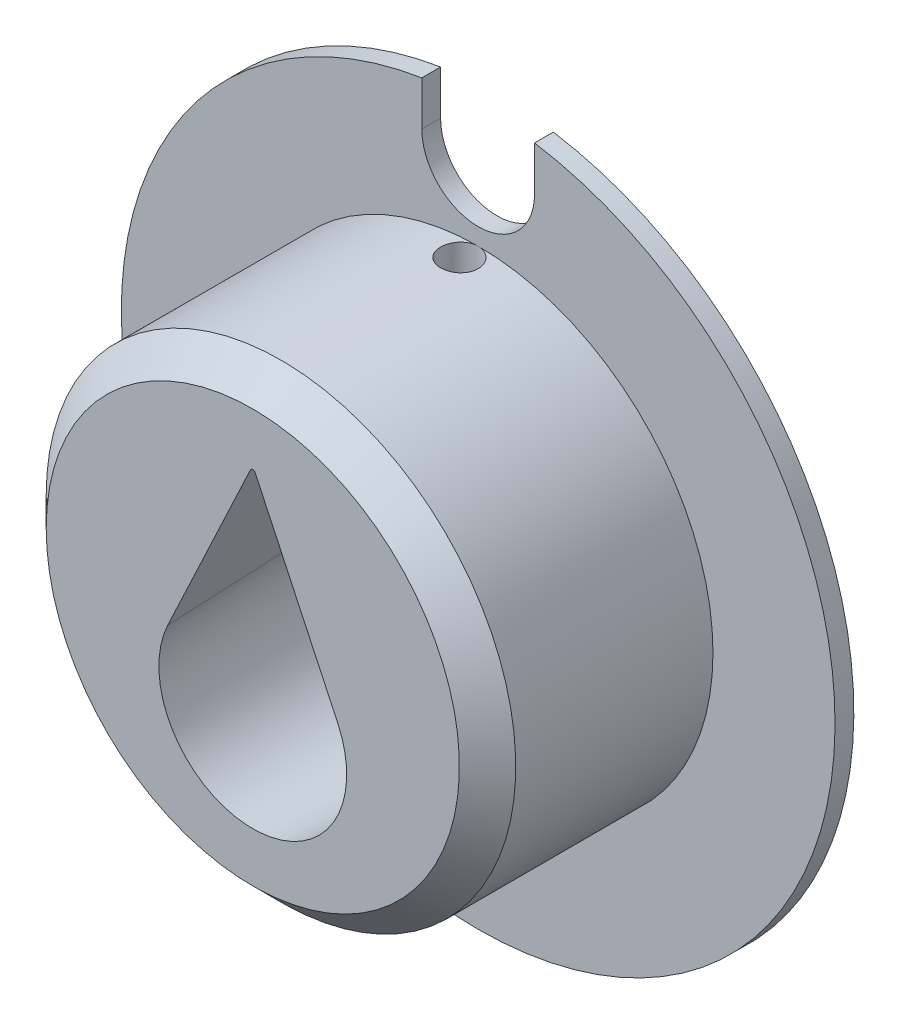
ISO-10303-21;
HEADER;
FILE_DESCRIPTION(('STEP AP214'),'2;1');
FILE_NAME('part.step','',(''),(''),'','','');
FILE_SCHEMA(('AUTOMOTIVE_DESIGN { 1 0 10303 214 1 1 1 1 }'));
ENDSEC;
DATA;
#1=APPLICATION_CONTEXT('core data for automotive mechanical design processes');
#2=APPLICATION_PROTOCOL_DEFINITION('international standard','automotive_design',2000,#1);
#3=PRODUCT_CONTEXT('',#1,'mechanical');
#4=PRODUCT('Part','Part','',(#3));
#5=PRODUCT_RELATED_PRODUCT_CATEGORY('part','',(#4));
#6=PRODUCT_DEFINITION_FORMATION('','',#4);
#7=PRODUCT_DEFINITION_CONTEXT('part definition',#1,'design');
#8=PRODUCT_DEFINITION('design','',#6,#7);
#9=PRODUCT_DEFINITION_SHAPE('','',#8);
#10=(LENGTH_UNIT() NAMED_UNIT(*) SI_UNIT(.MILLI.,.METRE.));
#11=(NAMED_UNIT(*) PLANE_ANGLE_UNIT() SI_UNIT($,.RADIAN.));
#12=(NAMED_UNIT(*) SI_UNIT($,.STERADIAN.) SOLID_ANGLE_UNIT());
#13=UNCERTAINTY_MEASURE_WITH_UNIT(LENGTH_MEASURE(1.E-05),#10,'distance_accuracy_value','');
#14=(GEOMETRIC_REPRESENTATION_CONTEXT(3) GLOBAL_UNCERTAINTY_ASSIGNED_CONTEXT((#13)) GLOBAL_UNIT_ASSIGNED_CONTEXT((#10,
#11,#12)) REPRESENTATION_CONTEXT('',''));
#15=CARTESIAN_POINT('',(0.,0.,0.));
#16=DIRECTION('',(0.,0.,1.));
#17=DIRECTION('',(1.,0.,0.));
#18=AXIS2_PLACEMENT_3D('',#15,#16,#17);
#19=CARTESIAN_POINT('',(0.,0.,9.));
#20=DIRECTION('',(0.,0.,-1.));
#21=DIRECTION('',(-1.,0.,0.));
#22=AXIS2_PLACEMENT_3D('',#19,#20,#21);
#23=CYLINDRICAL_SURFACE('',#22,6.25);
#24=CARTESIAN_POINT('',(0.,0.,3.));
#25=DIRECTION('',(0.,0.,-1.));
#26=DIRECTION('',(-1.,0.,0.));
#27=AXIS2_PLACEMENT_3D('',#24,#25,#26);
#28=CIRCLE('',#27,6.25);
#29=CARTESIAN_POINT('',(0.,6.25,3.));
#30=VERTEX_POINT('',#29);
#31=EDGE_CURVE('E32',#30,#30,#28,.T.);
#32=ORIENTED_EDGE('',*,*,#31,.F.);
#33=CARTESIAN_POINT('',(0.,6.25,3.));
#34=CARTESIAN_POINT('',(0.0280371253001472,6.24999973726825,3.00000122631142));
#35=CARTESIAN_POINT('',(0.0560934348317064,6.24980932835987,3.0023661721895));
#36=CARTESIAN_POINT('',(0.111430072594986,6.24906805640996,3.01176574466475));
#37=CARTESIAN_POINT('',(0.13870948046817,6.24851678300771,3.01880568761433));
#38=CARTESIAN_POINT('',(0.191682840003398,6.24711609070698,3.03735062025205));
#39=CARTESIAN_POINT('',(0.217377668615683,6.24626683849125,3.04885311406744));
#40=CARTESIAN_POINT('',(0.266465642013553,6.24436547738448,3.07599224203668));
#41=CARTESIAN_POINT('',(0.289859283846891,6.24331341244616,3.0916279807228));
#42=CARTESIAN_POINT('',(0.333742300182298,6.24112173977714,3.12662969111314));
#43=CARTESIAN_POINT('',(0.354225497117302,6.23998195352624,3.14600339737441));
#44=CARTESIAN_POINT('',(0.391653200331717,6.23774480136243,3.18791479932002));
#45=CARTESIAN_POINT('',(0.408597552554982,6.23664743729796,3.21045263267656));
#46=CARTESIAN_POINT('',(0.438487247055791,6.23461742818298,3.2580896139574));
#47=CARTESIAN_POINT('',(0.451427198936368,6.23368500588018,3.28319215437713));
#48=CARTESIAN_POINT('',(0.47290633559912,6.23209244752678,3.33522231532313));
#49=CARTESIAN_POINT('',(0.48144559263489,6.23143230700571,3.36214990587628));
#50=CARTESIAN_POINT('',(0.493863122648657,6.2304605230699,3.41700418950539));
#51=CARTESIAN_POINT('',(0.497751412100229,6.23014813083435,3.444928601639));
#52=CARTESIAN_POINT('',(0.500787572673645,6.2299048344347,3.5010353373683));
#53=CARTESIAN_POINT('',(0.499935526428083,6.2299739236207,3.52921765645965));
#54=CARTESIAN_POINT('',(0.493523485445101,6.23048510455905,3.58497164173605));
#55=CARTESIAN_POINT('',(0.487974367990048,6.23092633451481,3.61254456787794));
#56=CARTESIAN_POINT('',(0.472342597824917,6.23213072731034,3.666366394919));
#57=CARTESIAN_POINT('',(0.462259903885634,6.23289389307787,3.69261528377472));
#58=CARTESIAN_POINT('',(0.437834982183244,6.23465715733054,3.74307864220985));
#59=CARTESIAN_POINT('',(0.423487864579908,6.23565752754054,3.76729073516357));
#60=CARTESIAN_POINT('',(0.390944885405028,6.2377822264503,3.81296722105345));
#61=CARTESIAN_POINT('',(0.372748952089201,6.23890655746059,3.83443156275788));
#62=CARTESIAN_POINT('',(0.332963803987731,6.24115632313838,3.87406650500965));
#63=CARTESIAN_POINT('',(0.311365183881625,6.24228175200732,3.8922276662625));
#64=CARTESIAN_POINT('',(0.26542060855089,6.24440388310083,3.92466776746694));
#65=CARTESIAN_POINT('',(0.241074651674022,6.24540058524799,3.93894670508375));
#66=CARTESIAN_POINT('',(0.19032043271065,6.24715312810588,3.9632164072036));
#67=CARTESIAN_POINT('',(0.163911975060924,6.24790894594173,3.97320676448502));
#68=CARTESIAN_POINT('',(0.109785163019109,6.2490942899034,3.98860916208728));
#69=CARTESIAN_POINT('',(0.0820668336903354,6.24952382226973,3.99402128997134));
#70=CARTESIAN_POINT('',(0.0261889321731387,6.25000739678189,4.00010178848635));
#71=CARTESIAN_POINT('',(-0.00196921244664556,6.25006247112404,4.00078319948329));
#72=CARTESIAN_POINT('',(-0.0579993495723567,6.24979367891115,3.99741706678072));
#73=CARTESIAN_POINT('',(-0.0858713445331639,6.24946981560975,3.99336956368485));
#74=CARTESIAN_POINT('',(-0.140500896517588,6.24848024064224,3.98067130289432));
#75=CARTESIAN_POINT('',(-0.167259864766051,6.24781497707103,3.97202657860916));
#76=CARTESIAN_POINT('',(-0.21894746107236,6.2462173544727,3.95038542341034));
#77=CARTESIAN_POINT('',(-0.243876062388284,6.24528499154419,3.93738892893211));
#78=CARTESIAN_POINT('',(-0.291254704753548,6.24325515806218,3.90738030923662));
#79=CARTESIAN_POINT('',(-0.313699250646099,6.24215733365944,3.89035953237934));
#80=CARTESIAN_POINT('',(-0.355417220931437,6.2399211450223,3.85279801986943));
#81=CARTESIAN_POINT('',(-0.374690594533411,6.23878278013893,3.83225722784954));
#82=CARTESIAN_POINT('',(-0.409563751394793,6.23659076644032,3.78818223325993));
#83=CARTESIAN_POINT('',(-0.425155033855744,6.2355373172887,3.7646412933597));
#84=CARTESIAN_POINT('',(-0.452163167785297,6.2336371852181,3.71526783665319));
#85=CARTESIAN_POINT('',(-0.463580058120952,6.23279050037398,3.68943534118596));
#86=CARTESIAN_POINT('',(-0.481900800325804,6.23140084704309,3.63624233291608));
#87=CARTESIAN_POINT('',(-0.488809882158768,6.23085752669851,3.60888363098464));
#88=CARTESIAN_POINT('',(-0.497935921356451,6.23013491855302,3.55338996281983));
#89=CARTESIAN_POINT('',(-0.500152960976823,6.22995562437042,3.52525501020359));
#90=CARTESIAN_POINT('',(-0.499831063667594,6.22998145214326,3.46909197313821));
#91=CARTESIAN_POINT('',(-0.497305484404978,6.23018549442577,3.44106381066362));
#92=CARTESIAN_POINT('',(-0.487597866474767,6.23095271163564,3.38583104953433));
#93=CARTESIAN_POINT('',(-0.48041582042746,6.23151588713218,3.35862645218491));
#94=CARTESIAN_POINT('',(-0.461602464519074,6.23293763281346,3.30581200230384));
#95=CARTESIAN_POINT('',(-0.449971365719533,6.23379618898524,3.28020207418864));
#96=CARTESIAN_POINT('',(-0.42259160441907,6.23571197551083,3.2312962746957));
#97=CARTESIAN_POINT('',(-0.406843014027547,6.23676920238523,3.20800036280259));
#98=CARTESIAN_POINT('',(-0.371625180777193,6.23896673852115,3.16431558013516));
#99=CARTESIAN_POINT('',(-0.352146071741278,6.2401072630191,3.14393467417313));
#100=CARTESIAN_POINT('',(-0.310037538411447,6.24234092898227,3.10672370384485));
#101=CARTESIAN_POINT('',(-0.287407351524958,6.24343405889331,3.08989450151431));
#102=CARTESIAN_POINT('',(-0.239598693433533,6.24545158510759,3.06024396146655));
#103=CARTESIAN_POINT('',(-0.214415838457446,6.24637568322809,3.04742967847556));
#104=CARTESIAN_POINT('',(-0.162265981601207,6.24794746022797,3.02622761525505));
#105=CARTESIAN_POINT('',(-0.135301078162863,6.24859545775776,3.01783472958725));
#106=CARTESIAN_POINT('',(-0.0901466821133579,6.24937504876413,3.00785909230123));
#107=CARTESIAN_POINT('',(-0.0722478652821303,6.2496083431509,3.00491583071927));
#108=CARTESIAN_POINT('',(-0.036235370112305,6.24992090349081,3.00098589061893));
#109=CARTESIAN_POINT('',(-0.0181216922924021,6.2500001698157,2.99999920737815));
#110=CARTESIAN_POINT('',(0.,6.25,3.));
#111=B_SPLINE_CURVE_WITH_KNOTS('',3,(#33,#34,#35,#36,#37,#38,#39,#40,#41,#42,#43,#44,#45,#46,
#47,#48,#49,#50,#51,#52,#53,#54,#55,#56,#57,#58,#59,#60,#61,#62,#63,#64,#65,#66,#67,#68,#69,#70,
#71,#72,#73,#74,#75,#76,#77,#78,#79,#80,#81,#82,#83,#84,#85,#86,#87,#88,#89,#90,#91,#92,#93,#94,
#95,#96,#97,#98,#99,#100,#101,#102,#103,#104,#105,#106,#107,#108,#109,#110),.UNSPECIFIED.,.T.,
.F.,(4,2,2,2,2,2,2,2,2,2,2,2,2,2,2,2,2,2,2,2,2,2,2,2,2,2,2,2,2,2,2,2,2,2,2,2,2,2,4),(0.,
0.0840452135611058,0.168186166407756,0.252280127506076,0.336355884553493,0.420607512916354,
0.504862808232158,0.589231032691725,0.673597871892385,0.757782686917918,0.841966034454997,
0.925954965362483,1.00994466009668,1.09403103637424,1.17811898021154,1.26244356573239,
1.34676820196608,1.43110084346485,1.51543187198092,1.59953034680621,1.68362809954609,
1.76761575349234,1.85160463426614,1.93577574801151,2.01994820974521,2.10431314012213,
2.18867728497155,2.27294337558098,2.35720798891899,2.4412356254397,2.52526339513031,
2.60928717906662,2.69330949159769,2.77755716742354,2.86182526758717,2.94624061777091,
3.03055827773024,3.08488072193688,3.13920303503064),.UNSPECIFIED.);
#112=EDGE_CURVE('E121',#30,#30,#111,.T.);
#113=ORIENTED_EDGE('',*,*,#112,.T.);
#114=EDGE_LOOP('',(#32,#113));
#115=FACE_BOUND('',#114,.T.);
#116=CARTESIAN_POINT('',(0.,0.,8.24999999997544));
#117=DIRECTION('',(0.,0.,-1.));
#118=DIRECTION('',(-1.,0.,0.));
#119=AXIS2_PLACEMENT_3D('',#116,#117,#118);
#120=CIRCLE('',#119,6.24999999996589);
#121=CARTESIAN_POINT('',(-6.24999999996589,0.,8.24999999997544));
#122=VERTEX_POINT('',#121);
#123=EDGE_CURVE('E223',#122,#122,#120,.F.);
#124=ORIENTED_EDGE('',*,*,#123,.F.);
#125=EDGE_LOOP('',(#124));
#126=FACE_BOUND('',#125,.T.);
#127=ADVANCED_FACE('F17',(#115,#126),#23,.T.);
#128=CARTESIAN_POINT('',(0.,0.,8.25000000003229));
#129=DIRECTION('',(0.,0.,-1.));
#130=DIRECTION('',(-1.,0.,0.));
#131=AXIS2_PLACEMENT_3D('',#128,#129,#130);
#132=CONICAL_SURFACE('',#131,6.24999999990905,0.785398163359553);
#133=CARTESIAN_POINT('',(0.,0.,8.99999999995771));
#134=DIRECTION('',(0.,0.,-1.));
#135=DIRECTION('',(-1.,0.,0.));
#136=AXIS2_PLACEMENT_3D('',#133,#134,#135);
#137=CIRCLE('',#136,5.50000000004047);
#138=CARTESIAN_POINT('',(-5.50000000004047,0.,8.99999999995771));
#139=VERTEX_POINT('',#138);
#140=EDGE_CURVE('E272',#139,#139,#137,.F.);
#141=ORIENTED_EDGE('',*,*,#140,.F.);
#142=EDGE_LOOP('',(#141));
#143=FACE_BOUND('',#142,.T.);
#144=ORIENTED_EDGE('',*,*,#123,.T.);
#145=EDGE_LOOP('',(#144));
#146=FACE_BOUND('',#145,.T.);
#147=ADVANCED_FACE('F227',(#143,#146),#132,.T.);
#148=CARTESIAN_POINT('',(0.,-0.059584240176571,3.));
#149=DIRECTION('',(0.,0.,1.));
#150=DIRECTION('',(1.,0.,0.));
#151=AXIS2_PLACEMENT_3D('',#148,#149,#150);
#152=PLANE('',#151);
#153=DIRECTION('',(0.,1.,0.));
#154=VECTOR('',#153,1.);
#155=CARTESIAN_POINT('',(1.5,0.,3.));
#156=LINE('',#155,#154);
#157=CARTESIAN_POINT('',(1.5,9.38083151964686,3.));
#158=VERTEX_POINT('',#157);
#159=CARTESIAN_POINT('',(1.5,8.2,3.));
#160=VERTEX_POINT('',#159);
#161=EDGE_CURVE('E140',#158,#160,#156,.F.);
#162=ORIENTED_EDGE('',*,*,#161,.T.);
#163=CARTESIAN_POINT('',(0.,8.2,3.));
#164=DIRECTION('',(0.,0.,-1.));
#165=DIRECTION('',(-1.,0.,0.));
#166=AXIS2_PLACEMENT_3D('',#163,#164,#165);
#167=CIRCLE('',#166,1.5);
#168=CARTESIAN_POINT('',(-1.5,8.2,3.));
#169=VERTEX_POINT('',#168);
#170=EDGE_CURVE('E134',#160,#169,#167,.T.);
#171=ORIENTED_EDGE('',*,*,#170,.T.);
#172=DIRECTION('',(0.,1.,0.));
#173=VECTOR('',#172,1.);
#174=CARTESIAN_POINT('',(-1.5,-0.059584240176571,3.));
#175=LINE('',#174,#173);
#176=CARTESIAN_POINT('',(-1.5,9.38083151964686,3.));
#177=VERTEX_POINT('',#176);
#178=EDGE_CURVE('E150',#169,#177,#175,.T.);
#179=ORIENTED_EDGE('',*,*,#178,.T.);
#180=CARTESIAN_POINT('',(0.,0.,3.));
#181=DIRECTION('',(0.,0.,-1.));
#182=DIRECTION('',(-1.,0.,0.));
#183=AXIS2_PLACEMENT_3D('',#180,#181,#182);
#184=CIRCLE('',#183,9.5);
#185=EDGE_CURVE('E143',#158,#177,#184,.T.);
#186=ORIENTED_EDGE('',*,*,#185,.F.);
#187=EDGE_LOOP('',(#162,#171,#179,#186));
#188=FACE_BOUND('',#187,.T.);
#189=ORIENTED_EDGE('',*,*,#31,.T.);
#190=EDGE_LOOP('',(#189));
#191=FACE_BOUND('',#190,.T.);
#192=ADVANCED_FACE('F235',(#188,#191),#152,.T.);
#193=CARTESIAN_POINT('',(0.,28.2674910222633,3.5));
#194=DIRECTION('',(0.,-1.,0.));
#195=DIRECTION('',(0.,0.,-1.));
#196=AXIS2_PLACEMENT_3D('',#193,#194,#195);
#197=CYLINDRICAL_SURFACE('',#196,0.5);
#198=ORIENTED_EDGE('',*,*,#112,.F.);
#199=EDGE_LOOP('',(#198));
#200=FACE_BOUND('',#199,.T.);
#201=CARTESIAN_POINT('',(-0.250817274673501,4.14795452170133,3.06746018134123));
#202=CARTESIAN_POINT('',(-0.244006082852035,4.1627502083227,3.06350734105646));
#203=CARTESIAN_POINT('',(-0.2359763792068,4.17682752165071,3.05906750475328));
#204=CARTESIAN_POINT('',(-0.21767721474517,4.20332864807713,3.04975438946278));
#205=CARTESIAN_POINT('',(-0.207403400243733,4.21574917040777,3.04488027899976));
#206=CARTESIAN_POINT('',(-0.184847607637735,4.2386540506456,3.03526150009232));
#207=CARTESIAN_POINT('',(-0.172566697264778,4.24913943172529,3.03051676438084));
#208=CARTESIAN_POINT('',(-0.146216907827758,4.26789373128577,3.02165571189768));
#209=CARTESIAN_POINT('',(-0.132149426443475,4.27616436686196,3.01753890936062));
#210=CARTESIAN_POINT('',(-0.102922646804896,4.28998205552671,3.01048306268738));
#211=CARTESIAN_POINT('',(-0.087801245277683,4.2955943306481,3.00751617985946));
#212=CARTESIAN_POINT('',(-0.0566160450535194,4.30410050503354,3.00296694378703));
#213=CARTESIAN_POINT('',(-0.0405532502965924,4.30699724615763,3.00138314323871));
#214=CARTESIAN_POINT('',(-0.0101282903542762,4.30970858692466,2.99990000156902));
#215=CARTESIAN_POINT('',(0.00419536681243467,4.30986330013499,2.99981479117987));
#216=CARTESIAN_POINT('',(0.0326454259012381,4.30794696944367,3.000864061204));
#217=CARTESIAN_POINT('',(0.0467718647135883,4.30587634760467,3.00199831033152));
#218=CARTESIAN_POINT('',(0.073759024385227,4.2997647232229,3.00529192022043));
#219=CARTESIAN_POINT('',(0.0866480567137187,4.29581979905928,3.00740117201235));
#220=CARTESIAN_POINT('',(0.111573425812772,4.28616680307556,3.01244157327593));
#221=CARTESIAN_POINT('',(0.123609556303814,4.28045830650186,3.01537292073232));
#222=CARTESIAN_POINT('',(0.147525178469413,4.26694528818334,3.02208520985651));
#223=CARTESIAN_POINT('',(0.159317279648406,4.25901086606745,3.02591495586622));
#224=CARTESIAN_POINT('',(0.181480793516368,4.24151124293375,3.03394852540449));
#225=CARTESIAN_POINT('',(0.191851306415446,4.23194501758876,3.03815258310138));
#226=CARTESIAN_POINT('',(0.21151474358677,4.21083938543498,3.04680856998977));
#227=CARTESIAN_POINT('',(0.220726024960051,4.19922436282755,3.05126223020192));
#228=CARTESIAN_POINT('',(0.237241733300536,4.17459312470688,3.05976896658942));
#229=CARTESIAN_POINT('',(0.244547397953062,4.16157782646226,3.06382230170478));
#230=CARTESIAN_POINT('',(0.25081727467558,4.14795452169681,3.06746018134244));
#231=B_SPLINE_CURVE_WITH_KNOTS('',3,(#201,#202,#203,#204,#205,#206,#207,#208,#209,#210,#211,
#212,#213,#214,#215,#216,#217,#218,#219,#220,#221,#222,#223,#224,#225,#226,#227,#228,#229,#230),
.UNSPECIFIED.,.F.,.F.,(4,2,2,2,2,2,2,2,2,2,2,2,2,2,4),(0.,0.0501854631246081,0.100469167216841,
0.150726208020933,0.200944170909987,0.249856470315556,0.298717524700735,0.341468720352304,
0.384211809135266,0.424967769672925,0.465733553881443,0.509717825010678,0.553729808554905,
0.599980467056846,0.646201010842926),.UNSPECIFIED.);
#232=CARTESIAN_POINT('',(-0.250817274679978,4.1479545217009,3.06746018119932));
#233=VERTEX_POINT('',#232);
#234=CARTESIAN_POINT('',(0.250817274674959,4.14795452169642,3.06746018134208));
#235=VERTEX_POINT('',#234);
#236=EDGE_CURVE('E170',#233,#235,#231,.T.);
#237=ORIENTED_EDGE('',*,*,#236,.T.);
#238=CARTESIAN_POINT('',(0.,4.64579702299932,3.5));
#239=DIRECTION('',(-0.90437463873081,-0.425309931638599,-0.0348994967025009));
#240=DIRECTION('',(0.424993607461819,-0.905047767827517,0.0164003526492217));
#241=AXIS2_PLACEMENT_3D('',#238,#239,#240);
#242=ELLIPSE('',#241,1.17561327118236,0.5);
#243=CARTESIAN_POINT('',(0.223006981979897,4.13487587798158,3.9475130009153));
#244=VERTEX_POINT('',#243);
#245=EDGE_CURVE('E116',#244,#235,#242,.F.);
#246=ORIENTED_EDGE('',*,*,#245,.F.);
#247=CARTESIAN_POINT('',(0.223006981981653,4.13487587798281,3.94751300091443));
#248=CARTESIAN_POINT('',(0.216850526681291,4.14771256993349,3.9505830293248));
#249=CARTESIAN_POINT('',(0.209616091286233,4.15991791757093,3.95402881406817));
#250=CARTESIAN_POINT('',(0.193208143584879,4.18285456804883,3.96124854020825));
#251=CARTESIAN_POINT('',(0.184033289722964,4.19358484254877,3.96502270757216));
#252=CARTESIAN_POINT('',(0.163977891532963,4.21333433940593,3.97246767509794));
#253=CARTESIAN_POINT('',(0.153098601104897,4.22235480891647,3.97613854892611));
#254=CARTESIAN_POINT('',(0.129857962328555,4.23846697420647,3.98299417578115));
#255=CARTESIAN_POINT('',(0.117497211615409,4.24555944401086,3.98617912366442));
#256=CARTESIAN_POINT('',(0.0916869929843889,4.25752367646588,3.99169713776785));
#257=CARTESIAN_POINT('',(0.078247101544128,4.26241287467666,3.99403686226528));
#258=CARTESIAN_POINT('',(0.050592525118742,4.26982580610592,3.99762858108752));
#259=CARTESIAN_POINT('',(0.0363784127324379,4.27235126302574,3.9988813679866));
#260=CARTESIAN_POINT('',(0.00902118264919303,4.27478324605742,4.00008841347165));
#261=CARTESIAN_POINT('',(-0.00409760215007805,4.2749128444261,4.00015327129384));
#262=CARTESIAN_POINT('',(-0.0301557525036609,4.27311474368247,3.9992599103992));
#263=CARTESIAN_POINT('',(-0.0430951510860083,4.27118742851859,3.99830188261665));
#264=CARTESIAN_POINT('',(-0.0679515477297527,4.26547216549353,3.99551340405252));
#265=CARTESIAN_POINT('',(-0.0798886090497775,4.26175430389006,3.99371588728716));
#266=CARTESIAN_POINT('',(-0.10296484970817,4.25263009053741,3.98942429230463));
#267=CARTESIAN_POINT('',(-0.114103745103063,4.24722314153416,3.98692996773227));
#268=CARTESIAN_POINT('',(-0.136056759686583,4.23447832158565,3.9812746794697));
#269=CARTESIAN_POINT('',(-0.146802586689267,4.22703770208082,3.97808089962389));
#270=CARTESIAN_POINT('',(-0.166941314724596,4.21060924337056,3.97142674350142));
#271=CARTESIAN_POINT('',(-0.176334143781945,4.20162132190926,3.96796635305691));
#272=CARTESIAN_POINT('',(-0.19257047484376,4.18341999257633,3.96150155136393));
#273=CARTESIAN_POINT('',(-0.199584238883891,4.17435997931984,3.95849177002849));
#274=CARTESIAN_POINT('',(-0.212304054318516,4.1552965970225,3.9527425762306));
#275=CARTESIAN_POINT('',(-0.218010895690594,4.14529380304075,3.9500030010136));
#276=CARTESIAN_POINT('',(-0.223006981981653,4.13487587798281,3.94751300091443));
#277=B_SPLINE_CURVE_WITH_KNOTS('',3,(#247,#248,#249,#250,#251,#252,#253,#254,#255,#256,#257,
#258,#259,#260,#261,#262,#263,#264,#265,#266,#267,#268,#269,#270,#271,#272,#273,#274,#275,#276),
.UNSPECIFIED.,.F.,.F.,(4,2,2,2,2,2,2,2,2,2,2,2,2,2,4),(0.,0.0436054552585368,0.0872411573455102,
0.130844907476169,0.174431126275392,0.217666093685462,0.260869508417811,0.300027759695599,
0.339178702878135,0.376908355531084,0.414651364357051,0.454850220292724,0.495051213893766,
0.530480479892626,0.565888273590296),.UNSPECIFIED.);
#278=CARTESIAN_POINT('',(-0.223006981980251,4.13487587798174,3.94751300091606));
#279=VERTEX_POINT('',#278);
#280=EDGE_CURVE('E114',#244,#279,#277,.T.);
#281=ORIENTED_EDGE('',*,*,#280,.T.);
#282=CARTESIAN_POINT('',(0.,4.64579702299932,3.5));
#283=DIRECTION('',(0.90437463873081,-0.425309931638599,-0.0348994967025009));
#284=DIRECTION('',(-0.424993607461819,-0.905047767827517,0.0164003526492217));
#285=AXIS2_PLACEMENT_3D('',#282,#283,#284);
#286=ELLIPSE('',#285,1.17561327118236,0.5);
#287=EDGE_CURVE('E99',#233,#279,#286,.F.);
#288=ORIENTED_EDGE('',*,*,#287,.F.);
#289=EDGE_LOOP('',(#237,#246,#281,#288));
#290=FACE_BOUND('',#289,.T.);
#291=ADVANCED_FACE('F115',(#200,#290),#197,.F.);
#292=CARTESIAN_POINT('',(0.,4.03,3.91719807902291));
#293=DIRECTION('',(0.,0.,-1.));
#294=DIRECTION('',(-1.,0.,0.));
#295=AXIS2_PLACEMENT_3D('',#292,#293,#294);
#296=CONICAL_SURFACE('',#295,0.247495354258831,0.0349065850404302);
#297=ORIENTED_EDGE('',*,*,#280,.F.);
#298=DIRECTION('',(-0.0315814582933012,-0.0148521500853025,0.999390827019096));
#299=VECTOR('',#298,1.);
#300=CARTESIAN_POINT('',(0.0633448126595082,4.05978984238179,9.));
#301=LINE('',#300,#299);
#302=CARTESIAN_POINT('',(0.0633448126592783,4.05978984238168,9.00000000000728));
#303=VERTEX_POINT('',#302);
#304=EDGE_CURVE('E148',#303,#244,#301,.F.);
#305=ORIENTED_EDGE('',*,*,#304,.F.);
#306=CARTESIAN_POINT('',(0.,4.03,9.00000000001455));
#307=DIRECTION('',(0.,0.,-1.));
#308=DIRECTION('',(-1.,0.,0.));
#309=AXIS2_PLACEMENT_3D('',#306,#307,#308);
#310=CIRCLE('',#309,0.0700000000009027);
#311=CARTESIAN_POINT('',(-0.0633448126592787,4.05978984238168,9.00000000000728));
#312=VERTEX_POINT('',#311);
#313=EDGE_CURVE('E120',#312,#303,#310,.T.);
#314=ORIENTED_EDGE('',*,*,#313,.F.);
#315=DIRECTION('',(0.0315814582933012,-0.0148521500853025,0.999390827019096));
#316=VECTOR('',#315,1.);
#317=CARTESIAN_POINT('',(-0.0633448126595086,4.05978984238179,9.));
#318=LINE('',#317,#316);
#319=EDGE_CURVE('E104',#279,#312,#318,.T.);
#320=ORIENTED_EDGE('',*,*,#319,.F.);
#321=EDGE_LOOP('',(#297,#305,#314,#320));
#322=FACE_BOUND('',#321,.T.);
#323=ADVANCED_FACE('F123',(#322),#296,.F.);
#324=CARTESIAN_POINT('',(0.,-0.059584240176571,9.));
#325=DIRECTION('',(0.,0.,1.));
#326=DIRECTION('',(1.,0.,0.));
#327=AXIS2_PLACEMENT_3D('',#324,#325,#326);
#328=PLANE('',#327);
#329=ORIENTED_EDGE('',*,*,#140,.T.);
#330=EDGE_LOOP('',(#329));
#331=FACE_BOUND('',#330,.T.);
#332=ORIENTED_EDGE('',*,*,#313,.T.);
#333=DIRECTION('',(0.425569176882662,-0.904925895135847,0.));
#334=VECTOR('',#333,1.);
#335=CARTESIAN_POINT('',(1.63827874447016,0.710866622746148,9.));
#336=LINE('',#335,#334);
#337=CARTESIAN_POINT('',(2.26231473783945,-0.616077057792825,9.00000000001091));
#338=VERTEX_POINT('',#337);
#339=EDGE_CURVE('E145',#338,#303,#336,.F.);
#340=ORIENTED_EDGE('',*,*,#339,.F.);
#341=CARTESIAN_POINT('',(0.,-1.68,9.00000000001455));
#342=DIRECTION('',(0.,0.,-1.));
#343=DIRECTION('',(-1.,0.,0.));
#344=AXIS2_PLACEMENT_3D('',#341,#342,#343);
#345=CIRCLE('',#344,2.50000000000128);
#346=CARTESIAN_POINT('',(-2.26231473784075,-0.616077057792923,9.00000000001091));
#347=VERTEX_POINT('',#346);
#348=EDGE_CURVE('E166',#338,#347,#345,.T.);
#349=ORIENTED_EDGE('',*,*,#348,.T.);
#350=DIRECTION('',(0.425569176882662,0.904925895135847,0.));
#351=VECTOR('',#350,1.);
#352=CARTESIAN_POINT('',(-1.63827874447016,0.710866622746148,9.));
#353=LINE('',#352,#351);
#354=EDGE_CURVE('E125',#312,#347,#353,.F.);
#355=ORIENTED_EDGE('',*,*,#354,.F.);
#356=EDGE_LOOP('',(#332,#340,#349,#355));
#357=FACE_BOUND('',#356,.T.);
#358=ADVANCED_FACE('F206',(#331,#357),#328,.T.);
#359=CARTESIAN_POINT('',(0.,0.,3.));
#360=DIRECTION('',(0.,0.,-1.));
#361=DIRECTION('',(-1.,0.,0.));
#362=AXIS2_PLACEMENT_3D('',#359,#360,#361);
#363=CYLINDRICAL_SURFACE('',#362,9.5);
#364=ORIENTED_EDGE('',*,*,#185,.T.);
#365=DIRECTION('',(0.,0.,1.));
#366=VECTOR('',#365,1.);
#367=CARTESIAN_POINT('',(-1.5,9.38083151964686,3.));
#368=LINE('',#367,#366);
#369=CARTESIAN_POINT('',(-1.5,9.38083151964686,2.5));
#370=VERTEX_POINT('',#369);
#371=EDGE_CURVE('E111',#177,#370,#368,.F.);
#372=ORIENTED_EDGE('',*,*,#371,.T.);
#373=CARTESIAN_POINT('',(0.,0.,2.5));
#374=DIRECTION('',(0.,0.,-1.));
#375=DIRECTION('',(-1.,0.,0.));
#376=AXIS2_PLACEMENT_3D('',#373,#374,#375);
#377=CIRCLE('',#376,9.5);
#378=CARTESIAN_POINT('',(1.5,9.38083151964686,2.5));
#379=VERTEX_POINT('',#378);
#380=EDGE_CURVE('E162',#370,#379,#377,.F.);
#381=ORIENTED_EDGE('',*,*,#380,.T.);
#382=DIRECTION('',(0.,0.,1.));
#383=VECTOR('',#382,1.);
#384=CARTESIAN_POINT('',(1.5,9.38083151964686,3.));
#385=LINE('',#384,#383);
#386=EDGE_CURVE('E141',#379,#158,#385,.T.);
#387=ORIENTED_EDGE('',*,*,#386,.T.);
#388=EDGE_LOOP('',(#364,#372,#381,#387));
#389=FACE_BOUND('',#388,.T.);
#390=ADVANCED_FACE('F202',(#389),#363,.T.);
#391=CARTESIAN_POINT('',(1.5,0.,3.));
#392=DIRECTION('',(1.,0.,0.));
#393=DIRECTION('',(0.,1.,0.));
#394=AXIS2_PLACEMENT_3D('',#391,#392,#393);
#395=PLANE('',#394);
#396=DIRECTION('',(0.,0.,-1.));
#397=VECTOR('',#396,1.);
#398=CARTESIAN_POINT('',(1.5,8.2,3.));
#399=LINE('',#398,#397);
#400=CARTESIAN_POINT('',(1.5,8.2,2.5));
#401=VERTEX_POINT('',#400);
#402=EDGE_CURVE('E137',#401,#160,#399,.F.);
#403=ORIENTED_EDGE('',*,*,#402,.T.);
#404=ORIENTED_EDGE('',*,*,#161,.F.);
#405=ORIENTED_EDGE('',*,*,#386,.F.);
#406=DIRECTION('',(0.,1.,0.));
#407=VECTOR('',#406,1.);
#408=CARTESIAN_POINT('',(1.5,-0.059584240176571,2.5));
#409=LINE('',#408,#407);
#410=EDGE_CURVE('E161',#379,#401,#409,.F.);
#411=ORIENTED_EDGE('',*,*,#410,.T.);
#412=EDGE_LOOP('',(#403,#404,#405,#411));
#413=FACE_BOUND('',#412,.T.);
#414=ADVANCED_FACE('F198',(#413),#395,.F.);
#415=CARTESIAN_POINT('',(0.,8.2,3.));
#416=DIRECTION('',(0.,0.,-1.));
#417=DIRECTION('',(-1.,0.,0.));
#418=AXIS2_PLACEMENT_3D('',#415,#416,#417);
#419=CYLINDRICAL_SURFACE('',#418,1.5);
#420=DIRECTION('',(0.,0.,1.));
#421=VECTOR('',#420,1.);
#422=CARTESIAN_POINT('',(-1.5,8.2,3.));
#423=LINE('',#422,#421);
#424=CARTESIAN_POINT('',(-1.5,8.2,2.5));
#425=VERTEX_POINT('',#424);
#426=EDGE_CURVE('E131',#425,#169,#423,.T.);
#427=ORIENTED_EDGE('',*,*,#426,.T.);
#428=ORIENTED_EDGE('',*,*,#170,.F.);
#429=ORIENTED_EDGE('',*,*,#402,.F.);
#430=CARTESIAN_POINT('',(0.,8.2,2.5));
#431=DIRECTION('',(0.,0.,-1.));
#432=DIRECTION('',(-1.,0.,0.));
#433=AXIS2_PLACEMENT_3D('',#430,#431,#432);
#434=CIRCLE('',#433,1.5);
#435=EDGE_CURVE('E157',#401,#425,#434,.T.);
#436=ORIENTED_EDGE('',*,*,#435,.T.);
#437=EDGE_LOOP('',(#427,#428,#429,#436));
#438=FACE_BOUND('',#437,.T.);
#439=ADVANCED_FACE('F194',(#438),#419,.F.);
#440=CARTESIAN_POINT('',(-1.5,0.,3.));
#441=DIRECTION('',(-1.,0.,0.));
#442=DIRECTION('',(0.,-1.,0.));
#443=AXIS2_PLACEMENT_3D('',#440,#441,#442);
#444=PLANE('',#443);
#445=ORIENTED_EDGE('',*,*,#371,.F.);
#446=ORIENTED_EDGE('',*,*,#178,.F.);
#447=ORIENTED_EDGE('',*,*,#426,.F.);
#448=DIRECTION('',(0.,1.,0.));
#449=VECTOR('',#448,1.);
#450=CARTESIAN_POINT('',(-1.5,-0.059584240176571,2.5));
#451=LINE('',#450,#449);
#452=EDGE_CURVE('E160',#425,#370,#451,.T.);
#453=ORIENTED_EDGE('',*,*,#452,.T.);
#454=EDGE_LOOP('',(#445,#446,#447,#453));
#455=FACE_BOUND('',#454,.T.);
#456=ADVANCED_FACE('F191',(#455),#444,.F.);
#457=CARTESIAN_POINT('',(-1.63827874447016,0.710866622746148,9.));
#458=DIRECTION('',(0.90437463873081,-0.425309931638599,-0.0348994967025009));
#459=DIRECTION('',(0.425569176882662,0.904925895135847,0.));
#460=AXIS2_PLACEMENT_3D('',#457,#458,#459);
#461=PLANE('',#460);
#462=DIRECTION('',(0.0315814582933012,-0.0148521500853025,0.999390827019096));
#463=VECTOR('',#462,1.);
#464=CARTESIAN_POINT('',(-15771.3003081002,7415.25803499777,-499000.));
#465=LINE('',#464,#463);
#466=CARTESIAN_POINT('',(-2.46771934368469,-0.519479237455922,2.50000000001251));
#467=VERTEX_POINT('',#466);
#468=EDGE_CURVE('E165',#347,#467,#465,.F.);
#469=ORIENTED_EDGE('',*,*,#468,.T.);
#470=DIRECTION('',(0.425569176882663,0.904925895135846,0.));
#471=VECTOR('',#470,1.);
#472=CARTESIAN_POINT('',(-2.46771934368211,-0.519479237456716,2.5));
#473=LINE('',#472,#471);
#474=CARTESIAN_POINT('',(-0.268749418503598,4.15638766271846,2.49999999998408));
#475=VERTEX_POINT('',#474);
#476=EDGE_CURVE('E156',#467,#475,#473,.T.);
#477=ORIENTED_EDGE('',*,*,#476,.T.);
#478=DIRECTION('',(0.0315814582933015,-0.0148521500853019,0.999390827019096));
#479=VECTOR('',#478,1.);
#480=CARTESIAN_POINT('',(-15769.1013381752,7419.93390189766,-499000.));
#481=LINE('',#480,#479);
#482=EDGE_CURVE('E107',#475,#233,#481,.T.);
#483=ORIENTED_EDGE('',*,*,#482,.T.);
#484=ORIENTED_EDGE('',*,*,#287,.T.);
#485=ORIENTED_EDGE('',*,*,#319,.T.);
#486=ORIENTED_EDGE('',*,*,#354,.T.);
#487=EDGE_LOOP('',(#469,#477,#483,#484,#485,#486));
#488=FACE_BOUND('',#487,.T.);
#489=ADVANCED_FACE('F102',(#488),#461,.T.);
#490=CARTESIAN_POINT('',(0.,4.03,2.50000000005457));
#491=DIRECTION('',(0.,0.,-1.));
#492=DIRECTION('',(-1.,0.,0.));
#493=AXIS2_PLACEMENT_3D('',#490,#491,#492);
#494=CONICAL_SURFACE('',#493,0.296985001696726,0.0349065850412856);
#495=ORIENTED_EDGE('',*,*,#236,.F.);
#496=ORIENTED_EDGE('',*,*,#482,.F.);
#497=CARTESIAN_POINT('',(0.,4.03,2.49999999999773));
#498=DIRECTION('',(0.,0.,-1.));
#499=DIRECTION('',(-1.,0.,0.));
#500=AXIS2_PLACEMENT_3D('',#497,#498,#499);
#501=CIRCLE('',#500,0.296985001698711);
#502=CARTESIAN_POINT('',(0.268749418502035,4.15638766271843,2.49999999999886));
#503=VERTEX_POINT('',#502);
#504=EDGE_CURVE('E153',#475,#503,#501,.T.);
#505=ORIENTED_EDGE('',*,*,#504,.T.);
#506=DIRECTION('',(-0.0315814582933012,-0.0148521500853025,0.999390827019096));
#507=VECTOR('',#506,1.);
#508=CARTESIAN_POINT('',(0.0633448126595095,4.05978984238179,9.));
#509=LINE('',#508,#507);
#510=EDGE_CURVE('E149',#235,#503,#509,.F.);
#511=ORIENTED_EDGE('',*,*,#510,.F.);
#512=EDGE_LOOP('',(#495,#496,#505,#511));
#513=FACE_BOUND('',#512,.T.);
#514=ADVANCED_FACE('F181',(#513),#494,.F.);
#515=CARTESIAN_POINT('',(1.63827874447016,0.710866622746148,9.));
#516=DIRECTION('',(-0.90437463873081,-0.425309931638599,-0.0348994967025009));
#517=DIRECTION('',(0.425569176882662,-0.904925895135847,0.));
#518=AXIS2_PLACEMENT_3D('',#515,#516,#517);
#519=PLANE('',#518);
#520=ORIENTED_EDGE('',*,*,#339,.T.);
#521=ORIENTED_EDGE('',*,*,#304,.T.);
#522=ORIENTED_EDGE('',*,*,#245,.T.);
#523=ORIENTED_EDGE('',*,*,#510,.T.);
#524=DIRECTION('',(0.425569176882663,-0.904925895135846,0.));
#525=VECTOR('',#524,1.);
#526=CARTESIAN_POINT('',(0.268749418501999,4.15638766271841,2.5));
#527=LINE('',#526,#525);
#528=CARTESIAN_POINT('',(2.4677193436833,-0.519479237455135,2.50000000001251));
#529=VERTEX_POINT('',#528);
#530=EDGE_CURVE('E26',#503,#529,#527,.T.);
#531=ORIENTED_EDGE('',*,*,#530,.T.);
#532=DIRECTION('',(-0.0315814582933012,-0.0148521500853025,0.999390827019096));
#533=VECTOR('',#532,1.);
#534=CARTESIAN_POINT('',(15771.3003081002,7415.25803499778,-499000.));
#535=LINE('',#534,#533);
#536=EDGE_CURVE('E40',#529,#338,#535,.T.);
#537=ORIENTED_EDGE('',*,*,#536,.T.);
#538=EDGE_LOOP('',(#520,#521,#522,#523,#531,#537));
#539=FACE_BOUND('',#538,.T.);
#540=ADVANCED_FACE('F186',(#539),#519,.T.);
#541=CARTESIAN_POINT('',(0.,-1.68,2.50000000005457));
#542=DIRECTION('',(0.,0.,-1.));
#543=DIRECTION('',(-1.,0.,0.));
#544=AXIS2_PLACEMENT_3D('',#541,#542,#543);
#545=CONICAL_SURFACE('',#544,2.7269850016971,0.0349065850400188);
#546=ORIENTED_EDGE('',*,*,#468,.F.);
#547=ORIENTED_EDGE('',*,*,#348,.F.);
#548=ORIENTED_EDGE('',*,*,#536,.F.);
#549=CARTESIAN_POINT('',(0.,-1.68,2.49999999999773));
#550=DIRECTION('',(0.,0.,-1.));
#551=DIRECTION('',(-1.,0.,0.));
#552=AXIS2_PLACEMENT_3D('',#549,#550,#551);
#553=CIRCLE('',#552,2.72698500169909);
#554=EDGE_CURVE('E11',#529,#467,#553,.T.);
#555=ORIENTED_EDGE('',*,*,#554,.T.);
#556=EDGE_LOOP('',(#546,#547,#548,#555));
#557=FACE_BOUND('',#556,.T.);
#558=ADVANCED_FACE('F239',(#557),#545,.F.);
#559=CARTESIAN_POINT('',(0.,-0.059584240176571,2.5));
#560=DIRECTION('',(0.,0.,1.));
#561=DIRECTION('',(1.,0.,0.));
#562=AXIS2_PLACEMENT_3D('',#559,#560,#561);
#563=PLANE('',#562);
#564=ORIENTED_EDGE('',*,*,#530,.F.);
#565=ORIENTED_EDGE('',*,*,#504,.F.);
#566=ORIENTED_EDGE('',*,*,#476,.F.);
#567=ORIENTED_EDGE('',*,*,#554,.F.);
#568=EDGE_LOOP('',(#564,#565,#566,#567));
#569=FACE_BOUND('',#568,.T.);
#570=ORIENTED_EDGE('',*,*,#435,.F.);
#571=ORIENTED_EDGE('',*,*,#410,.F.);
#572=ORIENTED_EDGE('',*,*,#380,.F.);
#573=ORIENTED_EDGE('',*,*,#452,.F.);
#574=EDGE_LOOP('',(#570,#571,#572,#573));
#575=FACE_BOUND('',#574,.T.);
#576=ADVANCED_FACE('F237',(#569,#575),#563,.F.);
#577=CLOSED_SHELL('',(#127,#147,#192,#291,#323,#358,#390,#414,#439,#456,#489,#514,#540,#558,#576));
#578=MANIFOLD_SOLID_BREP('B1',#577);
#579=ADVANCED_BREP_SHAPE_REPRESENTATION('',(#18,#578),#14);
#580=SHAPE_DEFINITION_REPRESENTATION(#9,#579);
ENDSEC;
END-ISO-10303-21;
